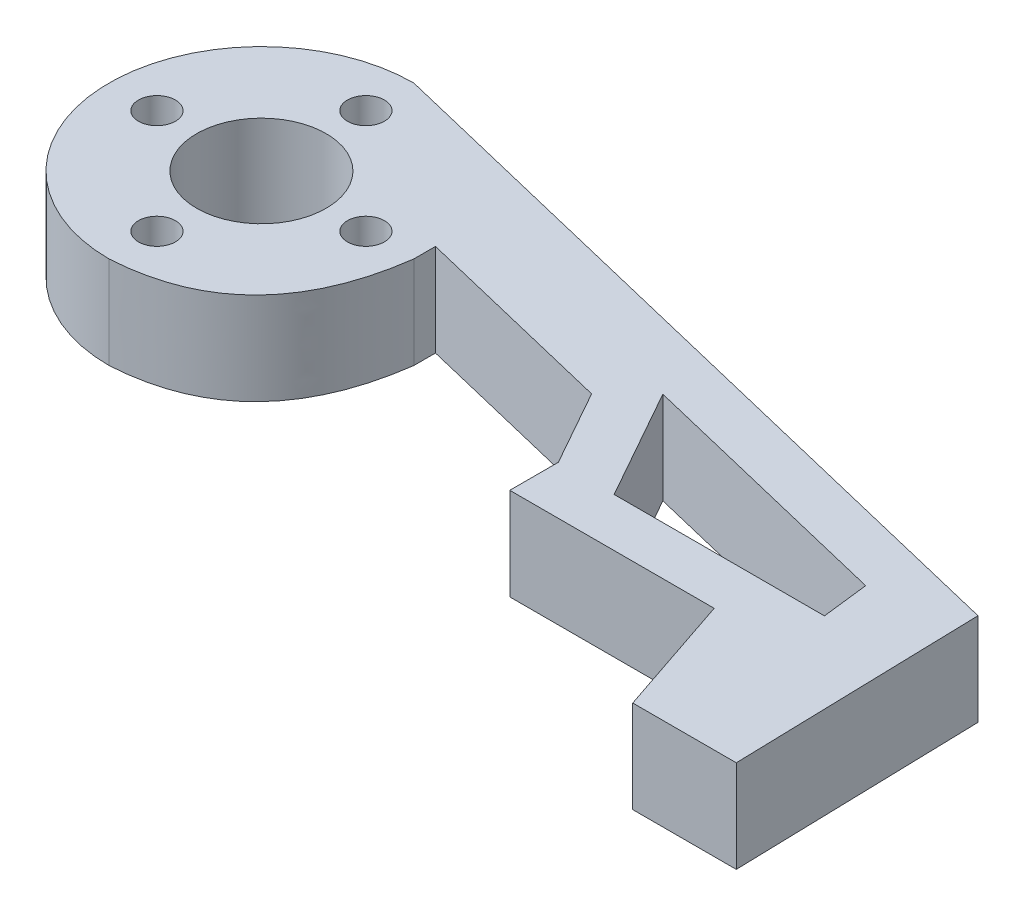
ISO-10303-21;
HEADER;
FILE_DESCRIPTION(('STEP AP214'),'2;1');
FILE_NAME('part.step','',(''),(''),'','','');
FILE_SCHEMA(('AUTOMOTIVE_DESIGN { 1 0 10303 214 1 1 1 1 }'));
ENDSEC;
DATA;
#1=APPLICATION_CONTEXT('core data for automotive mechanical design processes');
#2=APPLICATION_PROTOCOL_DEFINITION('international standard','automotive_design',2000,#1);
#3=PRODUCT_CONTEXT('',#1,'mechanical');
#4=PRODUCT('Part','Part','',(#3));
#5=PRODUCT_RELATED_PRODUCT_CATEGORY('part','',(#4));
#6=PRODUCT_DEFINITION_FORMATION('','',#4);
#7=PRODUCT_DEFINITION_CONTEXT('part definition',#1,'design');
#8=PRODUCT_DEFINITION('design','',#6,#7);
#9=PRODUCT_DEFINITION_SHAPE('','',#8);
#10=(LENGTH_UNIT() NAMED_UNIT(*) SI_UNIT(.MILLI.,.METRE.));
#11=(NAMED_UNIT(*) PLANE_ANGLE_UNIT() SI_UNIT($,.RADIAN.));
#12=(NAMED_UNIT(*) SI_UNIT($,.STERADIAN.) SOLID_ANGLE_UNIT());
#13=UNCERTAINTY_MEASURE_WITH_UNIT(LENGTH_MEASURE(1.E-05),#10,'distance_accuracy_value','');
#14=(GEOMETRIC_REPRESENTATION_CONTEXT(3) GLOBAL_UNCERTAINTY_ASSIGNED_CONTEXT((#13)) GLOBAL_UNIT_ASSIGNED_CONTEXT((#10,
#11,#12)) REPRESENTATION_CONTEXT('',''));
#15=CARTESIAN_POINT('',(0.,0.,0.));
#16=DIRECTION('',(0.,0.,1.));
#17=DIRECTION('',(1.,0.,0.));
#18=AXIS2_PLACEMENT_3D('',#15,#16,#17);
#19=CARTESIAN_POINT('',(0.,10.,16.5));
#20=DIRECTION('',(0.,0.,-1.));
#21=DIRECTION('',(-1.,0.,0.));
#22=AXIS2_PLACEMENT_3D('',#19,#20,#21);
#23=PLANE('',#22);
#24=DIRECTION('',(0.,1.,0.));
#25=VECTOR('',#24,1.);
#26=CARTESIAN_POINT('',(43.3955796582196,0.,16.5));
#27=LINE('',#26,#25);
#28=CARTESIAN_POINT('',(43.3955796582196,0.,16.5));
#29=VERTEX_POINT('',#28);
#30=CARTESIAN_POINT('',(43.3955796582196,10.,16.5));
#31=VERTEX_POINT('',#30);
#32=EDGE_CURVE('E536',#29,#31,#27,.T.);
#33=ORIENTED_EDGE('',*,*,#32,.F.);
#34=DIRECTION('',(1.,0.,0.));
#35=VECTOR('',#34,1.);
#36=CARTESIAN_POINT('',(0.,0.,16.5));
#37=LINE('',#36,#35);
#38=CARTESIAN_POINT('',(65.529162167536,0.,16.5));
#39=VERTEX_POINT('',#38);
#40=EDGE_CURVE('E243',#29,#39,#37,.T.);
#41=ORIENTED_EDGE('',*,*,#40,.T.);
#42=DIRECTION('',(0.,-1.,0.));
#43=VECTOR('',#42,1.);
#44=CARTESIAN_POINT('',(65.529162167536,10.,16.5));
#45=LINE('',#44,#43);
#46=CARTESIAN_POINT('',(65.529162167536,10.,16.5));
#47=VERTEX_POINT('',#46);
#48=EDGE_CURVE('E114',#47,#39,#45,.T.);
#49=ORIENTED_EDGE('',*,*,#48,.F.);
#50=DIRECTION('',(1.,0.,0.));
#51=VECTOR('',#50,1.);
#52=CARTESIAN_POINT('',(0.,10.,16.5));
#53=LINE('',#52,#51);
#54=EDGE_CURVE('E233',#31,#47,#53,.T.);
#55=ORIENTED_EDGE('',*,*,#54,.F.);
#56=EDGE_LOOP('',(#33,#41,#49,#55));
#57=FACE_BOUND('',#56,.T.);
#58=ADVANCED_FACE('F106',(#57),#23,.F.);
#59=CARTESIAN_POINT('',(0.,10.,0.));
#60=DIRECTION('',(0.,1.,0.));
#61=DIRECTION('',(0.,0.,1.));
#62=AXIS2_PLACEMENT_3D('',#59,#60,#61);
#63=PLANE('',#62);
#64=CARTESIAN_POINT('',(0.,10.,0.));
#65=DIRECTION('',(0.,1.,0.));
#66=DIRECTION('',(0.,0.,1.));
#67=AXIS2_PLACEMENT_3D('',#64,#65,#66);
#68=CIRCLE('',#67,7.01);
#69=CARTESIAN_POINT('',(0.,10.,7.01));
#70=VERTEX_POINT('',#69);
#71=EDGE_CURVE('E260',#70,#70,#68,.T.);
#72=ORIENTED_EDGE('',*,*,#71,.F.);
#73=EDGE_LOOP('',(#72));
#74=FACE_BOUND('',#73,.T.);
#75=CARTESIAN_POINT('',(0.,10.,-11.314));
#76=DIRECTION('',(0.,1.,0.));
#77=DIRECTION('',(0.,0.,1.));
#78=AXIS2_PLACEMENT_3D('',#75,#76,#77);
#79=CIRCLE('',#78,2.);
#80=CARTESIAN_POINT('',(0.,10.,-9.314));
#81=VERTEX_POINT('',#80);
#82=EDGE_CURVE('E582',#81,#81,#79,.T.);
#83=ORIENTED_EDGE('',*,*,#82,.F.);
#84=EDGE_LOOP('',(#83));
#85=FACE_BOUND('',#84,.T.);
#86=CARTESIAN_POINT('',(11.3140000000002,10.,-2.26596881978533E-13));
#87=DIRECTION('',(0.,1.,0.));
#88=DIRECTION('',(0.,0.,1.));
#89=AXIS2_PLACEMENT_3D('',#86,#87,#88);
#90=CIRCLE('',#89,2.);
#91=CARTESIAN_POINT('',(11.3140000000002,10.,1.99999999999977));
#92=VERTEX_POINT('',#91);
#93=EDGE_CURVE('E585',#92,#92,#90,.T.);
#94=ORIENTED_EDGE('',*,*,#93,.F.);
#95=EDGE_LOOP('',(#94));
#96=FACE_BOUND('',#95,.T.);
#97=CARTESIAN_POINT('',(4.53193763957066E-13,10.,11.314));
#98=DIRECTION('',(0.,1.,0.));
#99=DIRECTION('',(0.,0.,1.));
#100=AXIS2_PLACEMENT_3D('',#97,#98,#99);
#101=CIRCLE('',#100,2.);
#102=CARTESIAN_POINT('',(4.53193763957066E-13,10.,13.314));
#103=VERTEX_POINT('',#102);
#104=EDGE_CURVE('E588',#103,#103,#101,.T.);
#105=ORIENTED_EDGE('',*,*,#104,.F.);
#106=EDGE_LOOP('',(#105));
#107=FACE_BOUND('',#106,.T.);
#108=CARTESIAN_POINT('',(-11.3139999999998,10.,2.27982447367088E-13));
#109=DIRECTION('',(0.,1.,0.));
#110=DIRECTION('',(0.,0.,1.));
#111=AXIS2_PLACEMENT_3D('',#108,#109,#110);
#112=CIRCLE('',#111,2.);
#113=CARTESIAN_POINT('',(-11.3139999999998,10.,2.00000000000023));
#114=VERTEX_POINT('',#113);
#115=EDGE_CURVE('E234',#114,#114,#112,.T.);
#116=ORIENTED_EDGE('',*,*,#115,.F.);
#117=EDGE_LOOP('',(#116));
#118=FACE_BOUND('',#117,.T.);
#119=DIRECTION('',(1.,0.,0.));
#120=VECTOR('',#119,1.);
#121=CARTESIAN_POINT('',(0.,10.,11.2393825492216));
#122=LINE('',#121,#120);
#123=CARTESIAN_POINT('',(49.4355290913959,10.,11.2393825492216));
#124=VERTEX_POINT('',#123);
#125=CARTESIAN_POINT('',(72.2091222347467,10.,11.2393825492216));
#126=VERTEX_POINT('',#125);
#127=EDGE_CURVE('E568',#124,#126,#122,.T.);
#128=ORIENTED_EDGE('',*,*,#127,.F.);
#129=DIRECTION('',(-0.489850925462053,0.,-0.871806211737431));
#130=VECTOR('',#129,1.);
#131=CARTESIAN_POINT('',(32.7734442353219,10.,-18.414759809129));
#132=LINE('',#131,#130);
#133=CARTESIAN_POINT('',(42.6704875867528,10.,-0.800617581116616));
#134=VERTEX_POINT('',#133);
#135=EDGE_CURVE('E121',#124,#134,#132,.T.);
#136=ORIENTED_EDGE('',*,*,#135,.T.);
#137=DIRECTION('',(-0.972143238752156,0.,-0.234387549474091));
#138=VECTOR('',#137,1.);
#139=CARTESIAN_POINT('',(2.52663824622866,10.,-10.4794571783145));
#140=LINE('',#139,#138);
#141=CARTESIAN_POINT('',(71.6079483413903,10.,6.17631775506727));
#142=VERTEX_POINT('',#141);
#143=EDGE_CURVE('E558',#142,#134,#140,.T.);
#144=ORIENTED_EDGE('',*,*,#143,.F.);
#145=DIRECTION('',(0.117908891044264,0.,0.99302441732956));
#146=VECTOR('',#145,1.);
#147=CARTESIAN_POINT('',(69.8892555083318,10.,-8.29845114489442));
#148=LINE('',#147,#146);
#149=EDGE_CURVE('E570',#142,#126,#148,.T.);
#150=ORIENTED_EDGE('',*,*,#149,.T.);
#151=EDGE_LOOP('',(#128,#136,#144,#150));
#152=FACE_BOUND('',#151,.T.);
#153=DIRECTION('',(0.489850925462052,0.,0.871806211737431));
#154=VECTOR('',#153,1.);
#155=CARTESIAN_POINT('',(28.1828044006608,10.,-15.8353687229033));
#156=LINE('',#155,#154);
#157=CARTESIAN_POINT('',(38.7793110979798,10.,3.02363486625227));
#158=VERTEX_POINT('',#157);
#159=CARTESIAN_POINT('',(43.3955796582196,10.,11.2393825492217));
#160=VERTEX_POINT('',#159);
#161=EDGE_CURVE('E544',#158,#160,#156,.T.);
#162=ORIENTED_EDGE('',*,*,#161,.T.);
#163=DIRECTION('',(0.,0.,1.));
#164=VECTOR('',#163,1.);
#165=CARTESIAN_POINT('',(43.3955796582196,10.,0.));
#166=LINE('',#165,#164);
#167=EDGE_CURVE('E522',#160,#31,#166,.T.);
#168=ORIENTED_EDGE('',*,*,#167,.T.);
#169=ORIENTED_EDGE('',*,*,#54,.T.);
#170=DIRECTION('',(0.318855560608059,0.,0.947803318979904));
#171=VECTOR('',#170,1.);
#172=CARTESIAN_POINT('',(53.8803824769772,10.,-18.1261863262556));
#173=LINE('',#172,#171);
#174=CARTESIAN_POINT('',(70.,10.,29.7896378791369));
#175=VERTEX_POINT('',#174);
#176=EDGE_CURVE('E277',#47,#175,#173,.T.);
#177=ORIENTED_EDGE('',*,*,#176,.T.);
#178=DIRECTION('',(1.,0.,0.));
#179=VECTOR('',#178,1.);
#180=CARTESIAN_POINT('',(0.,10.,29.7896378791369));
#181=LINE('',#180,#179);
#182=CARTESIAN_POINT('',(81.2112604500866,10.,29.7896378791369));
#183=VERTEX_POINT('',#182);
#184=EDGE_CURVE('E294',#175,#183,#181,.T.);
#185=ORIENTED_EDGE('',*,*,#184,.T.);
#186=DIRECTION('',(-0.0261580352866349,0.,-0.999657820051413));
#187=VECTOR('',#186,1.);
#188=CARTESIAN_POINT('',(80.3767204699647,10.,-2.10321676888317));
#189=LINE('',#188,#187);
#190=CARTESIAN_POINT('',(80.5079215587423,10.,2.91077579434441));
#191=VERTEX_POINT('',#190);
#192=EDGE_CURVE('E293',#183,#191,#189,.T.);
#193=ORIENTED_EDGE('',*,*,#192,.T.);
#194=DIRECTION('',(-0.972143238752156,0.,-0.234387549474091));
#195=VECTOR('',#194,1.);
#196=CARTESIAN_POINT('',(3.75966147923724,10.,-15.5935308647503));
#197=LINE('',#196,#195);
#198=CARTESIAN_POINT('',(0.,10.,-16.5));
#199=VERTEX_POINT('',#198);
#200=EDGE_CURVE('E229',#191,#199,#197,.T.);
#201=ORIENTED_EDGE('',*,*,#200,.T.);
#202=CARTESIAN_POINT('',(0.,10.,0.));
#203=DIRECTION('',(0.,1.,0.));
#204=DIRECTION('',(0.,0.,1.));
#205=AXIS2_PLACEMENT_3D('',#202,#203,#204);
#206=CIRCLE('',#205,16.5);
#207=CARTESIAN_POINT('',(0.,10.,16.5));
#208=VERTEX_POINT('',#207);
#209=EDGE_CURVE('E225',#199,#208,#206,.T.);
#210=ORIENTED_EDGE('',*,*,#209,.T.);
#211=CARTESIAN_POINT('',(0.,10.,16.5));
#212=CARTESIAN_POINT('',(14.394754892929,10.,15.6567655630437));
#213=CARTESIAN_POINT('',(16.5,10.,0.));
#214=B_SPLINE_CURVE_WITH_KNOTS('',2,(#211,#212,#213),.UNSPECIFIED.,.F.,.F.,(3,3),(0.,1.),.UNSPECIFIED.);
#215=CARTESIAN_POINT('',(16.5,10.,0.));
#216=VERTEX_POINT('',#215);
#217=EDGE_CURVE('E212',#208,#216,#214,.T.);
#218=ORIENTED_EDGE('',*,*,#217,.T.);
#219=DIRECTION('',(0.,0.,-1.));
#220=VECTOR('',#219,1.);
#221=CARTESIAN_POINT('',(16.5,10.,0.));
#222=LINE('',#221,#220);
#223=CARTESIAN_POINT('',(16.5,10.,-2.34799446167409));
#224=VERTEX_POINT('',#223);
#225=EDGE_CURVE('E538',#216,#224,#222,.T.);
#226=ORIENTED_EDGE('',*,*,#225,.T.);
#227=DIRECTION('',(-0.972143238752156,0.,-0.234387549474091));
#228=VECTOR('',#227,1.);
#229=CARTESIAN_POINT('',(1.44147909470541,10.,-5.97866294035104));
#230=LINE('',#229,#228);
#231=EDGE_CURVE('E540',#158,#224,#230,.T.);
#232=ORIENTED_EDGE('',*,*,#231,.F.);
#233=EDGE_LOOP('',(#162,#168,#169,#177,#185,#193,#201,#210,#218,#226,#232));
#234=FACE_BOUND('',#233,.T.);
#235=ADVANCED_FACE('F227',(#74,#85,#96,#107,#118,#152,#234),#63,.T.);
#236=CARTESIAN_POINT('',(0.,0.,0.));
#237=DIRECTION('',(0.,1.,0.));
#238=DIRECTION('',(0.,0.,1.));
#239=AXIS2_PLACEMENT_3D('',#236,#237,#238);
#240=PLANE('',#239);
#241=DIRECTION('',(-0.489850925462053,0.,-0.871806211737431));
#242=VECTOR('',#241,1.);
#243=CARTESIAN_POINT('',(32.7734442353219,0.,-18.414759809129));
#244=LINE('',#243,#242);
#245=CARTESIAN_POINT('',(49.4355290913959,0.,11.2393825492216));
#246=VERTEX_POINT('',#245);
#247=CARTESIAN_POINT('',(42.6704875867528,0.,-0.800617581116616));
#248=VERTEX_POINT('',#247);
#249=EDGE_CURVE('E555',#246,#248,#244,.T.);
#250=ORIENTED_EDGE('',*,*,#249,.F.);
#251=DIRECTION('',(1.,0.,0.));
#252=VECTOR('',#251,1.);
#253=CARTESIAN_POINT('',(0.,0.,11.2393825492216));
#254=LINE('',#253,#252);
#255=CARTESIAN_POINT('',(72.2091222347467,0.,11.2393825492216));
#256=VERTEX_POINT('',#255);
#257=EDGE_CURVE('E557',#246,#256,#254,.T.);
#258=ORIENTED_EDGE('',*,*,#257,.T.);
#259=DIRECTION('',(0.117908891044264,0.,0.99302441732956));
#260=VECTOR('',#259,1.);
#261=CARTESIAN_POINT('',(69.8892555083318,0.,-8.29845114489442));
#262=LINE('',#261,#260);
#263=CARTESIAN_POINT('',(71.6079483413903,0.,6.17631775506727));
#264=VERTEX_POINT('',#263);
#265=EDGE_CURVE('E561',#264,#256,#262,.T.);
#266=ORIENTED_EDGE('',*,*,#265,.F.);
#267=DIRECTION('',(-0.972143238752156,0.,-0.234387549474091));
#268=VECTOR('',#267,1.);
#269=CARTESIAN_POINT('',(2.52663824622866,0.,-10.4794571783145));
#270=LINE('',#269,#268);
#271=EDGE_CURVE('E563',#264,#248,#270,.T.);
#272=ORIENTED_EDGE('',*,*,#271,.T.);
#273=EDGE_LOOP('',(#250,#258,#266,#272));
#274=FACE_BOUND('',#273,.T.);
#275=CARTESIAN_POINT('',(0.,0.,0.));
#276=DIRECTION('',(0.,1.,0.));
#277=DIRECTION('',(0.,0.,1.));
#278=AXIS2_PLACEMENT_3D('',#275,#276,#277);
#279=CIRCLE('',#278,7.01);
#280=CARTESIAN_POINT('',(0.,0.,7.01));
#281=VERTEX_POINT('',#280);
#282=EDGE_CURVE('E300',#281,#281,#279,.T.);
#283=ORIENTED_EDGE('',*,*,#282,.T.);
#284=EDGE_LOOP('',(#283));
#285=FACE_BOUND('',#284,.T.);
#286=CARTESIAN_POINT('',(0.,0.,-11.314));
#287=DIRECTION('',(0.,1.,0.));
#288=DIRECTION('',(0.,0.,1.));
#289=AXIS2_PLACEMENT_3D('',#286,#287,#288);
#290=CIRCLE('',#289,2.);
#291=CARTESIAN_POINT('',(0.,0.,-9.314));
#292=VERTEX_POINT('',#291);
#293=EDGE_CURVE('E303',#292,#292,#290,.T.);
#294=ORIENTED_EDGE('',*,*,#293,.T.);
#295=EDGE_LOOP('',(#294));
#296=FACE_BOUND('',#295,.T.);
#297=CARTESIAN_POINT('',(11.3140000000002,0.,-2.26596881978533E-13));
#298=DIRECTION('',(0.,1.,0.));
#299=DIRECTION('',(0.,0.,1.));
#300=AXIS2_PLACEMENT_3D('',#297,#298,#299);
#301=CIRCLE('',#300,2.);
#302=CARTESIAN_POINT('',(11.3140000000002,0.,1.99999999999977));
#303=VERTEX_POINT('',#302);
#304=EDGE_CURVE('E307',#303,#303,#301,.T.);
#305=ORIENTED_EDGE('',*,*,#304,.T.);
#306=EDGE_LOOP('',(#305));
#307=FACE_BOUND('',#306,.T.);
#308=CARTESIAN_POINT('',(4.53193763957066E-13,0.,11.314));
#309=DIRECTION('',(0.,1.,0.));
#310=DIRECTION('',(0.,0.,1.));
#311=AXIS2_PLACEMENT_3D('',#308,#309,#310);
#312=CIRCLE('',#311,2.);
#313=CARTESIAN_POINT('',(4.53193763957066E-13,0.,13.314));
#314=VERTEX_POINT('',#313);
#315=EDGE_CURVE('E249',#314,#314,#312,.T.);
#316=ORIENTED_EDGE('',*,*,#315,.T.);
#317=EDGE_LOOP('',(#316));
#318=FACE_BOUND('',#317,.T.);
#319=CARTESIAN_POINT('',(-11.3139999999998,0.,2.27982447367088E-13));
#320=DIRECTION('',(0.,1.,0.));
#321=DIRECTION('',(0.,0.,1.));
#322=AXIS2_PLACEMENT_3D('',#319,#320,#321);
#323=CIRCLE('',#322,2.);
#324=CARTESIAN_POINT('',(-11.3139999999998,0.,2.00000000000023));
#325=VERTEX_POINT('',#324);
#326=EDGE_CURVE('E244',#325,#325,#323,.T.);
#327=ORIENTED_EDGE('',*,*,#326,.T.);
#328=EDGE_LOOP('',(#327));
#329=FACE_BOUND('',#328,.T.);
#330=DIRECTION('',(0.,0.,1.));
#331=VECTOR('',#330,1.);
#332=CARTESIAN_POINT('',(43.3955796582196,0.,0.));
#333=LINE('',#332,#331);
#334=CARTESIAN_POINT('',(43.3955796582196,0.,11.2393825492217));
#335=VERTEX_POINT('',#334);
#336=EDGE_CURVE('E541',#335,#29,#333,.T.);
#337=ORIENTED_EDGE('',*,*,#336,.F.);
#338=DIRECTION('',(0.489850925462052,0.,0.871806211737431));
#339=VECTOR('',#338,1.);
#340=CARTESIAN_POINT('',(28.1828044006608,0.,-15.8353687229033));
#341=LINE('',#340,#339);
#342=CARTESIAN_POINT('',(38.7793110979798,0.,3.02363486625227));
#343=VERTEX_POINT('',#342);
#344=EDGE_CURVE('E552',#343,#335,#341,.T.);
#345=ORIENTED_EDGE('',*,*,#344,.F.);
#346=DIRECTION('',(-0.972143238752156,0.,-0.234387549474091));
#347=VECTOR('',#346,1.);
#348=CARTESIAN_POINT('',(1.44147909470541,0.,-5.97866294035104));
#349=LINE('',#348,#347);
#350=CARTESIAN_POINT('',(16.5,0.,-2.34799446167409));
#351=VERTEX_POINT('',#350);
#352=EDGE_CURVE('E549',#343,#351,#349,.T.);
#353=ORIENTED_EDGE('',*,*,#352,.T.);
#354=DIRECTION('',(0.,0.,-1.));
#355=VECTOR('',#354,1.);
#356=CARTESIAN_POINT('',(16.5,0.,0.));
#357=LINE('',#356,#355);
#358=CARTESIAN_POINT('',(16.5,0.,0.));
#359=VERTEX_POINT('',#358);
#360=EDGE_CURVE('E530',#359,#351,#357,.T.);
#361=ORIENTED_EDGE('',*,*,#360,.F.);
#362=CARTESIAN_POINT('',(0.,0.,16.5));
#363=CARTESIAN_POINT('',(14.394754892929,0.,15.6567655630437));
#364=CARTESIAN_POINT('',(16.5,0.,0.));
#365=B_SPLINE_CURVE_WITH_KNOTS('',2,(#362,#363,#364),.UNSPECIFIED.,.F.,.F.,(3,3),(0.,1.),.UNSPECIFIED.);
#366=CARTESIAN_POINT('',(0.,0.,16.5));
#367=VERTEX_POINT('',#366);
#368=EDGE_CURVE('E222',#367,#359,#365,.T.);
#369=ORIENTED_EDGE('',*,*,#368,.F.);
#370=CARTESIAN_POINT('',(0.,0.,0.));
#371=DIRECTION('',(0.,1.,0.));
#372=DIRECTION('',(0.,0.,1.));
#373=AXIS2_PLACEMENT_3D('',#370,#371,#372);
#374=CIRCLE('',#373,16.5);
#375=CARTESIAN_POINT('',(0.,0.,-16.5));
#376=VERTEX_POINT('',#375);
#377=EDGE_CURVE('E239',#376,#367,#374,.T.);
#378=ORIENTED_EDGE('',*,*,#377,.F.);
#379=DIRECTION('',(-0.972143238752156,0.,-0.234387549474091));
#380=VECTOR('',#379,1.);
#381=CARTESIAN_POINT('',(3.75966147923724,0.,-15.5935308647503));
#382=LINE('',#381,#380);
#383=CARTESIAN_POINT('',(80.5079215587423,0.,2.91077579434441));
#384=VERTEX_POINT('',#383);
#385=EDGE_CURVE('E258',#384,#376,#382,.T.);
#386=ORIENTED_EDGE('',*,*,#385,.F.);
#387=DIRECTION('',(-0.0261580352866349,0.,-0.999657820051413));
#388=VECTOR('',#387,1.);
#389=CARTESIAN_POINT('',(80.3767204699647,0.,-2.10321676888317));
#390=LINE('',#389,#388);
#391=CARTESIAN_POINT('',(81.2112604500866,0.,29.7896378791369));
#392=VERTEX_POINT('',#391);
#393=EDGE_CURVE('E256',#392,#384,#390,.T.);
#394=ORIENTED_EDGE('',*,*,#393,.F.);
#395=DIRECTION('',(1.,0.,0.));
#396=VECTOR('',#395,1.);
#397=CARTESIAN_POINT('',(0.,0.,29.7896378791369));
#398=LINE('',#397,#396);
#399=CARTESIAN_POINT('',(70.,0.,29.7896378791369));
#400=VERTEX_POINT('',#399);
#401=EDGE_CURVE('E254',#400,#392,#398,.T.);
#402=ORIENTED_EDGE('',*,*,#401,.F.);
#403=DIRECTION('',(0.318855560608059,0.,0.947803318979904));
#404=VECTOR('',#403,1.);
#405=CARTESIAN_POINT('',(53.8803824769772,0.,-18.1261863262556));
#406=LINE('',#405,#404);
#407=EDGE_CURVE('E246',#39,#400,#406,.T.);
#408=ORIENTED_EDGE('',*,*,#407,.F.);
#409=ORIENTED_EDGE('',*,*,#40,.F.);
#410=EDGE_LOOP('',(#337,#345,#353,#361,#369,#378,#386,#394,#402,#408,#409));
#411=FACE_BOUND('',#410,.T.);
#412=ADVANCED_FACE('F283',(#274,#285,#296,#307,#318,#329,#411),#240,.F.);
#413=CARTESIAN_POINT('',(0.,10.,0.));
#414=DIRECTION('',(0.,-1.,0.));
#415=DIRECTION('',(0.,0.,-1.));
#416=AXIS2_PLACEMENT_3D('',#413,#414,#415);
#417=CYLINDRICAL_SURFACE('',#416,16.5);
#418=ORIENTED_EDGE('',*,*,#377,.T.);
#419=DIRECTION('',(0.,-1.,0.));
#420=VECTOR('',#419,1.);
#421=CARTESIAN_POINT('',(0.,10.,16.5));
#422=LINE('',#421,#420);
#423=EDGE_CURVE('E12',#208,#367,#422,.T.);
#424=ORIENTED_EDGE('',*,*,#423,.F.);
#425=ORIENTED_EDGE('',*,*,#209,.F.);
#426=DIRECTION('',(0.,-1.,0.));
#427=VECTOR('',#426,1.);
#428=CARTESIAN_POINT('',(0.,10.,-16.5));
#429=LINE('',#428,#427);
#430=EDGE_CURVE('E240',#199,#376,#429,.T.);
#431=ORIENTED_EDGE('',*,*,#430,.T.);
#432=EDGE_LOOP('',(#418,#424,#425,#431));
#433=FACE_BOUND('',#432,.T.);
#434=ADVANCED_FACE('F237',(#433),#417,.T.);
#435=CARTESIAN_POINT('',(53.8803824769772,10.,-18.1261863262556));
#436=DIRECTION('',(0.947803318979904,0.,-0.318855560608059));
#437=DIRECTION('',(-0.318855560608059,0.,-0.947803318979904));
#438=AXIS2_PLACEMENT_3D('',#435,#436,#437);
#439=PLANE('',#438);
#440=ORIENTED_EDGE('',*,*,#407,.T.);
#441=DIRECTION('',(0.,-1.,0.));
#442=VECTOR('',#441,1.);
#443=CARTESIAN_POINT('',(70.,10.,29.7896378791369));
#444=LINE('',#443,#442);
#445=EDGE_CURVE('E268',#175,#400,#444,.T.);
#446=ORIENTED_EDGE('',*,*,#445,.F.);
#447=ORIENTED_EDGE('',*,*,#176,.F.);
#448=ORIENTED_EDGE('',*,*,#48,.T.);
#449=EDGE_LOOP('',(#440,#446,#447,#448));
#450=FACE_BOUND('',#449,.T.);
#451=ADVANCED_FACE('F275',(#450),#439,.F.);
#452=CARTESIAN_POINT('',(0.,10.,29.7896378791369));
#453=DIRECTION('',(0.,0.,-1.));
#454=DIRECTION('',(-1.,0.,0.));
#455=AXIS2_PLACEMENT_3D('',#452,#453,#454);
#456=PLANE('',#455);
#457=ORIENTED_EDGE('',*,*,#401,.T.);
#458=DIRECTION('',(0.,-1.,0.));
#459=VECTOR('',#458,1.);
#460=CARTESIAN_POINT('',(81.2112604500866,10.,29.7896378791369));
#461=LINE('',#460,#459);
#462=EDGE_CURVE('E265',#183,#392,#461,.T.);
#463=ORIENTED_EDGE('',*,*,#462,.F.);
#464=ORIENTED_EDGE('',*,*,#184,.F.);
#465=ORIENTED_EDGE('',*,*,#445,.T.);
#466=EDGE_LOOP('',(#457,#463,#464,#465));
#467=FACE_BOUND('',#466,.T.);
#468=ADVANCED_FACE('F287',(#467),#456,.F.);
#469=CARTESIAN_POINT('',(80.3767204699647,10.,-2.10321676888317));
#470=DIRECTION('',(-0.999657820051413,0.,0.0261580352866349));
#471=DIRECTION('',(0.0261580352866349,0.,0.999657820051413));
#472=AXIS2_PLACEMENT_3D('',#469,#470,#471);
#473=PLANE('',#472);
#474=ORIENTED_EDGE('',*,*,#393,.T.);
#475=DIRECTION('',(0.,-1.,0.));
#476=VECTOR('',#475,1.);
#477=CARTESIAN_POINT('',(80.5079215587423,10.,2.91077579434441));
#478=LINE('',#477,#476);
#479=EDGE_CURVE('E262',#191,#384,#478,.T.);
#480=ORIENTED_EDGE('',*,*,#479,.F.);
#481=ORIENTED_EDGE('',*,*,#192,.F.);
#482=ORIENTED_EDGE('',*,*,#462,.T.);
#483=EDGE_LOOP('',(#474,#480,#481,#482));
#484=FACE_BOUND('',#483,.T.);
#485=ADVANCED_FACE('F291',(#484),#473,.F.);
#486=CARTESIAN_POINT('',(-11.3139999999998,10.,2.27982447367088E-13));
#487=DIRECTION('',(0.,-1.,0.));
#488=DIRECTION('',(0.,0.,-1.));
#489=AXIS2_PLACEMENT_3D('',#486,#487,#488);
#490=CYLINDRICAL_SURFACE('',#489,2.);
#491=ORIENTED_EDGE('',*,*,#115,.T.);
#492=EDGE_LOOP('',(#491));
#493=FACE_BOUND('',#492,.T.);
#494=ORIENTED_EDGE('',*,*,#326,.F.);
#495=EDGE_LOOP('',(#494));
#496=FACE_BOUND('',#495,.T.);
#497=ADVANCED_FACE('F317',(#493,#496),#490,.F.);
#498=CARTESIAN_POINT('',(4.53193763957066E-13,10.,11.314));
#499=DIRECTION('',(0.,-1.,0.));
#500=DIRECTION('',(0.,0.,-1.));
#501=AXIS2_PLACEMENT_3D('',#498,#499,#500);
#502=CYLINDRICAL_SURFACE('',#501,2.);
#503=ORIENTED_EDGE('',*,*,#104,.T.);
#504=EDGE_LOOP('',(#503));
#505=FACE_BOUND('',#504,.T.);
#506=ORIENTED_EDGE('',*,*,#315,.F.);
#507=EDGE_LOOP('',(#506));
#508=FACE_BOUND('',#507,.T.);
#509=ADVANCED_FACE('F314',(#505,#508),#502,.F.);
#510=CARTESIAN_POINT('',(11.3140000000002,10.,-2.26596881978533E-13));
#511=DIRECTION('',(0.,-1.,0.));
#512=DIRECTION('',(0.,0.,-1.));
#513=AXIS2_PLACEMENT_3D('',#510,#511,#512);
#514=CYLINDRICAL_SURFACE('',#513,2.);
#515=ORIENTED_EDGE('',*,*,#93,.T.);
#516=EDGE_LOOP('',(#515));
#517=FACE_BOUND('',#516,.T.);
#518=ORIENTED_EDGE('',*,*,#304,.F.);
#519=EDGE_LOOP('',(#518));
#520=FACE_BOUND('',#519,.T.);
#521=ADVANCED_FACE('F316',(#517,#520),#514,.F.);
#522=CARTESIAN_POINT('',(0.,10.,-11.314));
#523=DIRECTION('',(0.,-1.,0.));
#524=DIRECTION('',(0.,0.,-1.));
#525=AXIS2_PLACEMENT_3D('',#522,#523,#524);
#526=CYLINDRICAL_SURFACE('',#525,2.);
#527=ORIENTED_EDGE('',*,*,#82,.T.);
#528=EDGE_LOOP('',(#527));
#529=FACE_BOUND('',#528,.T.);
#530=ORIENTED_EDGE('',*,*,#293,.F.);
#531=EDGE_LOOP('',(#530));
#532=FACE_BOUND('',#531,.T.);
#533=ADVANCED_FACE('F324',(#529,#532),#526,.F.);
#534=CARTESIAN_POINT('',(0.,10.,0.));
#535=DIRECTION('',(0.,-1.,0.));
#536=DIRECTION('',(0.,0.,-1.));
#537=AXIS2_PLACEMENT_3D('',#534,#535,#536);
#538=CYLINDRICAL_SURFACE('',#537,7.01);
#539=ORIENTED_EDGE('',*,*,#71,.T.);
#540=EDGE_LOOP('',(#539));
#541=FACE_BOUND('',#540,.T.);
#542=ORIENTED_EDGE('',*,*,#282,.F.);
#543=EDGE_LOOP('',(#542));
#544=FACE_BOUND('',#543,.T.);
#545=ADVANCED_FACE('F108',(#541,#544),#538,.F.);
#546=CARTESIAN_POINT('',(3.75966147923724,10.,-15.5935308647503));
#547=DIRECTION('',(-0.234387549474091,0.,0.972143238752156));
#548=DIRECTION('',(0.972143238752156,0.,0.234387549474091));
#549=AXIS2_PLACEMENT_3D('',#546,#547,#548);
#550=PLANE('',#549);
#551=ORIENTED_EDGE('',*,*,#385,.T.);
#552=ORIENTED_EDGE('',*,*,#430,.F.);
#553=ORIENTED_EDGE('',*,*,#200,.F.);
#554=ORIENTED_EDGE('',*,*,#479,.T.);
#555=EDGE_LOOP('',(#551,#552,#553,#554));
#556=FACE_BOUND('',#555,.T.);
#557=ADVANCED_FACE('F354',(#556),#550,.F.);
#558=CARTESIAN_POINT('',(32.7734442353219,0.,-18.414759809129));
#559=DIRECTION('',(0.871806211737431,0.,-0.489850925462053));
#560=DIRECTION('',(-0.489850925462053,0.,-0.871806211737431));
#561=AXIS2_PLACEMENT_3D('',#558,#559,#560);
#562=PLANE('',#561);
#563=ORIENTED_EDGE('',*,*,#135,.F.);
#564=DIRECTION('',(0.,1.,0.));
#565=VECTOR('',#564,1.);
#566=CARTESIAN_POINT('',(49.4355290913959,0.,11.2393825492216));
#567=LINE('',#566,#565);
#568=EDGE_CURVE('E566',#246,#124,#567,.T.);
#569=ORIENTED_EDGE('',*,*,#568,.F.);
#570=ORIENTED_EDGE('',*,*,#249,.T.);
#571=DIRECTION('',(0.,1.,0.));
#572=VECTOR('',#571,1.);
#573=CARTESIAN_POINT('',(42.6704875867528,0.,-0.800617581116616));
#574=LINE('',#573,#572);
#575=EDGE_CURVE('E304',#248,#134,#574,.T.);
#576=ORIENTED_EDGE('',*,*,#575,.T.);
#577=EDGE_LOOP('',(#563,#569,#570,#576));
#578=FACE_BOUND('',#577,.T.);
#579=ADVANCED_FACE('F357',(#578),#562,.T.);
#580=CARTESIAN_POINT('',(2.52663824622866,0.,-10.4794571783145));
#581=DIRECTION('',(0.234387549474091,0.,-0.972143238752156));
#582=DIRECTION('',(-0.972143238752156,0.,-0.234387549474091));
#583=AXIS2_PLACEMENT_3D('',#580,#581,#582);
#584=PLANE('',#583);
#585=ORIENTED_EDGE('',*,*,#143,.T.);
#586=ORIENTED_EDGE('',*,*,#575,.F.);
#587=ORIENTED_EDGE('',*,*,#271,.F.);
#588=DIRECTION('',(0.,1.,0.));
#589=VECTOR('',#588,1.);
#590=CARTESIAN_POINT('',(71.6079483413903,0.,6.17631775506727));
#591=LINE('',#590,#589);
#592=EDGE_CURVE('E576',#264,#142,#591,.T.);
#593=ORIENTED_EDGE('',*,*,#592,.T.);
#594=EDGE_LOOP('',(#585,#586,#587,#593));
#595=FACE_BOUND('',#594,.T.);
#596=ADVANCED_FACE('F437',(#595),#584,.F.);
#597=CARTESIAN_POINT('',(69.8892555083318,0.,-8.29845114489442));
#598=DIRECTION('',(-0.99302441732956,0.,0.117908891044264));
#599=DIRECTION('',(0.117908891044264,0.,0.99302441732956));
#600=AXIS2_PLACEMENT_3D('',#597,#598,#599);
#601=PLANE('',#600);
#602=ORIENTED_EDGE('',*,*,#149,.F.);
#603=ORIENTED_EDGE('',*,*,#592,.F.);
#604=ORIENTED_EDGE('',*,*,#265,.T.);
#605=DIRECTION('',(0.,1.,0.));
#606=VECTOR('',#605,1.);
#607=CARTESIAN_POINT('',(72.2091222347467,0.,11.2393825492216));
#608=LINE('',#607,#606);
#609=EDGE_CURVE('E129',#256,#126,#608,.T.);
#610=ORIENTED_EDGE('',*,*,#609,.T.);
#611=EDGE_LOOP('',(#602,#603,#604,#610));
#612=FACE_BOUND('',#611,.T.);
#613=ADVANCED_FACE('F445',(#612),#601,.T.);
#614=CARTESIAN_POINT('',(0.,0.,11.2393825492216));
#615=DIRECTION('',(0.,0.,1.));
#616=DIRECTION('',(1.,0.,0.));
#617=AXIS2_PLACEMENT_3D('',#614,#615,#616);
#618=PLANE('',#617);
#619=ORIENTED_EDGE('',*,*,#127,.T.);
#620=ORIENTED_EDGE('',*,*,#609,.F.);
#621=ORIENTED_EDGE('',*,*,#257,.F.);
#622=ORIENTED_EDGE('',*,*,#568,.T.);
#623=EDGE_LOOP('',(#619,#620,#621,#622));
#624=FACE_BOUND('',#623,.T.);
#625=ADVANCED_FACE('F455',(#624),#618,.F.);
#626=CARTESIAN_POINT('',(16.5,0.,0.));
#627=DIRECTION('',(1.,0.,0.));
#628=DIRECTION('',(0.,0.,-1.));
#629=AXIS2_PLACEMENT_3D('',#626,#627,#628);
#630=PLANE('',#629);
#631=ORIENTED_EDGE('',*,*,#225,.F.);
#632=DIRECTION('',(0.,1.,0.));
#633=VECTOR('',#632,1.);
#634=CARTESIAN_POINT('',(16.5,0.,0.));
#635=LINE('',#634,#633);
#636=EDGE_CURVE('E218',#359,#216,#635,.T.);
#637=ORIENTED_EDGE('',*,*,#636,.F.);
#638=ORIENTED_EDGE('',*,*,#360,.T.);
#639=DIRECTION('',(0.,1.,0.));
#640=VECTOR('',#639,1.);
#641=CARTESIAN_POINT('',(16.5,0.,-2.34799446167409));
#642=LINE('',#641,#640);
#643=EDGE_CURVE('E533',#351,#224,#642,.T.);
#644=ORIENTED_EDGE('',*,*,#643,.T.);
#645=EDGE_LOOP('',(#631,#637,#638,#644));
#646=FACE_BOUND('',#645,.T.);
#647=ADVANCED_FACE('F465',(#646),#630,.T.);
#648=CARTESIAN_POINT('',(1.44147909470541,0.,-5.97866294035104));
#649=DIRECTION('',(0.234387549474091,0.,-0.972143238752156));
#650=DIRECTION('',(-0.972143238752156,0.,-0.234387549474091));
#651=AXIS2_PLACEMENT_3D('',#648,#649,#650);
#652=PLANE('',#651);
#653=ORIENTED_EDGE('',*,*,#231,.T.);
#654=ORIENTED_EDGE('',*,*,#643,.F.);
#655=ORIENTED_EDGE('',*,*,#352,.F.);
#656=DIRECTION('',(0.,1.,0.));
#657=VECTOR('',#656,1.);
#658=CARTESIAN_POINT('',(38.7793110979798,0.,3.02363486625227));
#659=LINE('',#658,#657);
#660=EDGE_CURVE('E531',#343,#158,#659,.T.);
#661=ORIENTED_EDGE('',*,*,#660,.T.);
#662=EDGE_LOOP('',(#653,#654,#655,#661));
#663=FACE_BOUND('',#662,.T.);
#664=ADVANCED_FACE('F474',(#663),#652,.F.);
#665=CARTESIAN_POINT('',(28.1828044006608,0.,-15.8353687229033));
#666=DIRECTION('',(-0.871806211737431,0.,0.489850925462052));
#667=DIRECTION('',(0.489850925462052,0.,0.871806211737431));
#668=AXIS2_PLACEMENT_3D('',#665,#666,#667);
#669=PLANE('',#668);
#670=ORIENTED_EDGE('',*,*,#161,.F.);
#671=ORIENTED_EDGE('',*,*,#660,.F.);
#672=ORIENTED_EDGE('',*,*,#344,.T.);
#673=DIRECTION('',(0.,1.,0.));
#674=VECTOR('',#673,1.);
#675=CARTESIAN_POINT('',(43.3955796582196,0.,11.2393825492217));
#676=LINE('',#675,#674);
#677=EDGE_CURVE('E525',#335,#160,#676,.T.);
#678=ORIENTED_EDGE('',*,*,#677,.T.);
#679=EDGE_LOOP('',(#670,#671,#672,#678));
#680=FACE_BOUND('',#679,.T.);
#681=ADVANCED_FACE('F485',(#680),#669,.T.);
#682=CARTESIAN_POINT('',(43.3955796582196,0.,0.));
#683=DIRECTION('',(-1.,0.,0.));
#684=DIRECTION('',(0.,0.,1.));
#685=AXIS2_PLACEMENT_3D('',#682,#683,#684);
#686=PLANE('',#685);
#687=ORIENTED_EDGE('',*,*,#167,.F.);
#688=ORIENTED_EDGE('',*,*,#677,.F.);
#689=ORIENTED_EDGE('',*,*,#336,.T.);
#690=ORIENTED_EDGE('',*,*,#32,.T.);
#691=EDGE_LOOP('',(#687,#688,#689,#690));
#692=FACE_BOUND('',#691,.T.);
#693=ADVANCED_FACE('F495',(#692),#686,.T.);
#694=DIRECTION('',(0.,1.,0.));
#695=VECTOR('',#694,1.);
#696=SURFACE_OF_LINEAR_EXTRUSION('',#365,#695);
#697=ORIENTED_EDGE('',*,*,#217,.F.);
#698=ORIENTED_EDGE('',*,*,#423,.T.);
#699=ORIENTED_EDGE('',*,*,#368,.T.);
#700=ORIENTED_EDGE('',*,*,#636,.T.);
#701=EDGE_LOOP('',(#697,#698,#699,#700));
#702=FACE_BOUND('',#701,.T.);
#703=ADVANCED_FACE('F214',(#702),#696,.T.);
#704=CLOSED_SHELL('',(#58,#235,#412,#434,#451,#468,#485,#497,#509,#521,#533,#545,#557,#579,#596,
#613,#625,#647,#664,#681,#693,#703));
#705=MANIFOLD_SOLID_BREP('B2',#704);
#706=ADVANCED_BREP_SHAPE_REPRESENTATION('',(#18,#705),#14);
#707=SHAPE_DEFINITION_REPRESENTATION(#9,#706);
ENDSEC;
END-ISO-10303-21;
